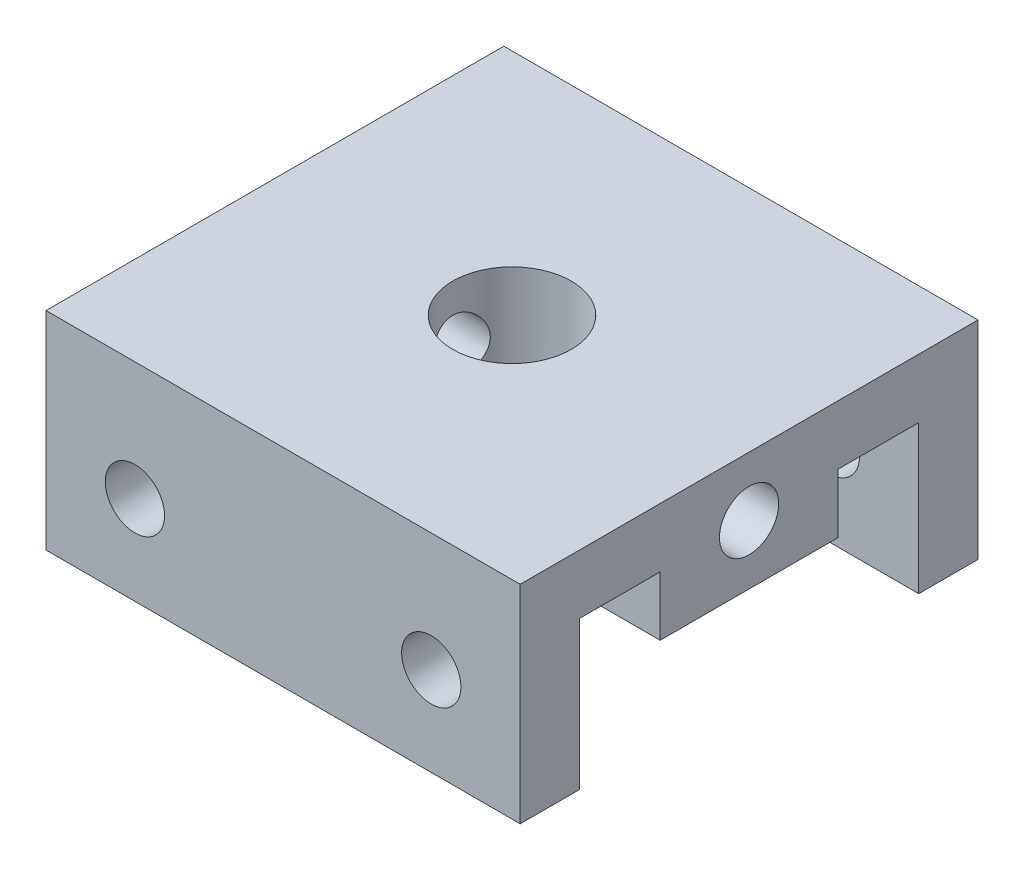
ISO-10303-21;
HEADER;
FILE_DESCRIPTION(('STEP AP214'),'2;1');
FILE_NAME('part.step','',(''),(''),'','','');
FILE_SCHEMA(('AUTOMOTIVE_DESIGN { 1 0 10303 214 1 1 1 1 }'));
ENDSEC;
DATA;
#1=APPLICATION_CONTEXT('core data for automotive mechanical design processes');
#2=APPLICATION_PROTOCOL_DEFINITION('international standard','automotive_design',2000,#1);
#3=PRODUCT_CONTEXT('',#1,'mechanical');
#4=PRODUCT('Part','Part','',(#3));
#5=PRODUCT_RELATED_PRODUCT_CATEGORY('part','',(#4));
#6=PRODUCT_DEFINITION_FORMATION('','',#4);
#7=PRODUCT_DEFINITION_CONTEXT('part definition',#1,'design');
#8=PRODUCT_DEFINITION('design','',#6,#7);
#9=PRODUCT_DEFINITION_SHAPE('','',#8);
#10=(LENGTH_UNIT() NAMED_UNIT(*) SI_UNIT(.MILLI.,.METRE.));
#11=(NAMED_UNIT(*) PLANE_ANGLE_UNIT() SI_UNIT($,.RADIAN.));
#12=(NAMED_UNIT(*) SI_UNIT($,.STERADIAN.) SOLID_ANGLE_UNIT());
#13=UNCERTAINTY_MEASURE_WITH_UNIT(LENGTH_MEASURE(1.E-05),#10,'distance_accuracy_value','');
#14=(GEOMETRIC_REPRESENTATION_CONTEXT(3) GLOBAL_UNCERTAINTY_ASSIGNED_CONTEXT((#13)) GLOBAL_UNIT_ASSIGNED_CONTEXT((#10,
#11,#12)) REPRESENTATION_CONTEXT('',''));
#15=CARTESIAN_POINT('',(0.,0.,0.));
#16=DIRECTION('',(0.,0.,1.));
#17=DIRECTION('',(1.,0.,0.));
#18=AXIS2_PLACEMENT_3D('',#15,#16,#17);
#19=CARTESIAN_POINT('',(-25.4,-6.35,18.17497));
#20=DIRECTION('',(0.,-1.,0.));
#21=DIRECTION('',(0.,0.,-1.));
#22=AXIS2_PLACEMENT_3D('',#19,#20,#21);
#23=PLANE('',#22);
#24=DIRECTION('',(0.,0.,-1.));
#25=VECTOR('',#24,1.);
#26=CARTESIAN_POINT('',(25.4,-6.35,18.17497));
#27=LINE('',#26,#25);
#28=CARTESIAN_POINT('',(25.4,-6.35,-9.525));
#29=VERTEX_POINT('',#28);
#30=CARTESIAN_POINT('',(25.4,-6.35,-18.17497));
#31=VERTEX_POINT('',#30);
#32=EDGE_CURVE('E190',#29,#31,#27,.T.);
#33=ORIENTED_EDGE('',*,*,#32,.F.);
#34=DIRECTION('',(1.,0.,0.));
#35=VECTOR('',#34,1.);
#36=CARTESIAN_POINT('',(25.4,-6.35,-9.525));
#37=LINE('',#36,#35);
#38=CARTESIAN_POINT('',(-25.4,-6.35,-9.525));
#39=VERTEX_POINT('',#38);
#40=EDGE_CURVE('E249',#39,#29,#37,.T.);
#41=ORIENTED_EDGE('',*,*,#40,.F.);
#42=DIRECTION('',(0.,0.,-1.));
#43=VECTOR('',#42,1.);
#44=CARTESIAN_POINT('',(-25.4,-6.35,18.17497));
#45=LINE('',#44,#43);
#46=CARTESIAN_POINT('',(-25.4,-6.35,-18.17497));
#47=VERTEX_POINT('',#46);
#48=EDGE_CURVE('E155',#39,#47,#45,.T.);
#49=ORIENTED_EDGE('',*,*,#48,.T.);
#50=DIRECTION('',(1.,0.,0.));
#51=VECTOR('',#50,1.);
#52=CARTESIAN_POINT('',(-25.4,-6.35,-18.17497));
#53=LINE('',#52,#51);
#54=EDGE_CURVE('E235',#47,#31,#53,.T.);
#55=ORIENTED_EDGE('',*,*,#54,.T.);
#56=EDGE_LOOP('',(#33,#41,#49,#55));
#57=FACE_BOUND('',#56,.T.);
#58=ADVANCED_FACE('F39',(#57),#23,.T.);
#59=CARTESIAN_POINT('',(-25.4,-6.35,18.17497));
#60=VERTEX_POINT('',#59);
#61=CARTESIAN_POINT('',(-25.4,-6.35,9.525));
#62=VERTEX_POINT('',#61);
#63=EDGE_CURVE('E214',#60,#62,#45,.T.);
#64=ORIENTED_EDGE('',*,*,#63,.T.);
#65=DIRECTION('',(-1.,0.,0.));
#66=VECTOR('',#65,1.);
#67=CARTESIAN_POINT('',(-25.4,-6.35,9.525));
#68=LINE('',#67,#66);
#69=CARTESIAN_POINT('',(25.4,-6.35,9.525));
#70=VERTEX_POINT('',#69);
#71=EDGE_CURVE('E150',#70,#62,#68,.T.);
#72=ORIENTED_EDGE('',*,*,#71,.F.);
#73=CARTESIAN_POINT('',(25.4,-6.35,18.17497));
#74=VERTEX_POINT('',#73);
#75=EDGE_CURVE('E191',#74,#70,#27,.T.);
#76=ORIENTED_EDGE('',*,*,#75,.F.);
#77=DIRECTION('',(1.,0.,0.));
#78=VECTOR('',#77,1.);
#79=CARTESIAN_POINT('',(-25.4,-6.35,18.17497));
#80=LINE('',#79,#78);
#81=EDGE_CURVE('E238',#60,#74,#80,.T.);
#82=ORIENTED_EDGE('',*,*,#81,.F.);
#83=EDGE_LOOP('',(#64,#72,#76,#82));
#84=FACE_BOUND('',#83,.T.);
#85=ADVANCED_FACE('F273',(#84),#23,.T.);
#86=CARTESIAN_POINT('',(-25.4,0.,24.52497));
#87=DIRECTION('',(0.,0.,1.));
#88=DIRECTION('',(0.,-1.,0.));
#89=AXIS2_PLACEMENT_3D('',#86,#87,#88);
#90=PLANE('',#89);
#91=CARTESIAN_POINT('',(15.875,-12.7,24.52497));
#92=DIRECTION('',(0.,0.,1.));
#93=DIRECTION('',(1.,0.,0.));
#94=AXIS2_PLACEMENT_3D('',#91,#92,#93);
#95=CIRCLE('',#94,3.175);
#96=CARTESIAN_POINT('',(19.05,-12.7,24.52497));
#97=VERTEX_POINT('',#96);
#98=EDGE_CURVE('E156',#97,#97,#95,.T.);
#99=ORIENTED_EDGE('',*,*,#98,.F.);
#100=EDGE_LOOP('',(#99));
#101=FACE_BOUND('',#100,.T.);
#102=CARTESIAN_POINT('',(-15.875,-12.7,24.52497));
#103=DIRECTION('',(0.,0.,1.));
#104=DIRECTION('',(1.,0.,0.));
#105=AXIS2_PLACEMENT_3D('',#102,#103,#104);
#106=CIRCLE('',#105,3.175);
#107=CARTESIAN_POINT('',(-12.7,-12.7,24.52497));
#108=VERTEX_POINT('',#107);
#109=EDGE_CURVE('E171',#108,#108,#106,.T.);
#110=ORIENTED_EDGE('',*,*,#109,.F.);
#111=EDGE_LOOP('',(#110));
#112=FACE_BOUND('',#111,.T.);
#113=DIRECTION('',(1.,0.,0.));
#114=VECTOR('',#113,1.);
#115=CARTESIAN_POINT('',(-25.4,-22.225,24.52497));
#116=LINE('',#115,#114);
#117=CARTESIAN_POINT('',(-25.4,-22.225,24.52497));
#118=VERTEX_POINT('',#117);
#119=CARTESIAN_POINT('',(25.4,-22.225,24.52497));
#120=VERTEX_POINT('',#119);
#121=EDGE_CURVE('E228',#118,#120,#116,.T.);
#122=ORIENTED_EDGE('',*,*,#121,.T.);
#123=DIRECTION('',(0.,-1.,0.));
#124=VECTOR('',#123,1.);
#125=CARTESIAN_POINT('',(25.4,0.,24.52497));
#126=LINE('',#125,#124);
#127=CARTESIAN_POINT('',(25.4,0.,24.52497));
#128=VERTEX_POINT('',#127);
#129=EDGE_CURVE('E181',#128,#120,#126,.T.);
#130=ORIENTED_EDGE('',*,*,#129,.F.);
#131=DIRECTION('',(1.,0.,0.));
#132=VECTOR('',#131,1.);
#133=CARTESIAN_POINT('',(-25.4,0.,24.52497));
#134=LINE('',#133,#132);
#135=CARTESIAN_POINT('',(-25.4,0.,24.52497));
#136=VERTEX_POINT('',#135);
#137=EDGE_CURVE('E11',#136,#128,#134,.T.);
#138=ORIENTED_EDGE('',*,*,#137,.F.);
#139=DIRECTION('',(0.,-1.,0.));
#140=VECTOR('',#139,1.);
#141=CARTESIAN_POINT('',(-25.4,0.,24.52497));
#142=LINE('',#141,#140);
#143=EDGE_CURVE('E206',#136,#118,#142,.T.);
#144=ORIENTED_EDGE('',*,*,#143,.T.);
#145=EDGE_LOOP('',(#122,#130,#138,#144));
#146=FACE_BOUND('',#145,.T.);
#147=ADVANCED_FACE('F41',(#101,#112,#146),#90,.T.);
#148=CARTESIAN_POINT('',(-25.4,0.,24.52497));
#149=DIRECTION('',(0.,1.,0.));
#150=DIRECTION('',(0.,0.,1.));
#151=AXIS2_PLACEMENT_3D('',#148,#149,#150);
#152=PLANE('',#151);
#153=CARTESIAN_POINT('',(0.,0.,0.));
#154=DIRECTION('',(0.,1.,0.));
#155=DIRECTION('',(0.,0.,1.));
#156=AXIS2_PLACEMENT_3D('',#153,#154,#155);
#157=CIRCLE('',#156,6.35);
#158=CARTESIAN_POINT('',(0.,0.,6.35));
#159=VERTEX_POINT('',#158);
#160=EDGE_CURVE('E250',#159,#159,#157,.T.);
#161=ORIENTED_EDGE('',*,*,#160,.F.);
#162=EDGE_LOOP('',(#161));
#163=FACE_BOUND('',#162,.T.);
#164=ORIENTED_EDGE('',*,*,#137,.T.);
#165=DIRECTION('',(0.,0.,1.));
#166=VECTOR('',#165,1.);
#167=CARTESIAN_POINT('',(25.4,0.,24.52497));
#168=LINE('',#167,#166);
#169=CARTESIAN_POINT('',(25.4,0.,-24.52497));
#170=VERTEX_POINT('',#169);
#171=EDGE_CURVE('E203',#170,#128,#168,.T.);
#172=ORIENTED_EDGE('',*,*,#171,.F.);
#173=DIRECTION('',(1.,0.,0.));
#174=VECTOR('',#173,1.);
#175=CARTESIAN_POINT('',(-25.4,0.,-24.52497));
#176=LINE('',#175,#174);
#177=CARTESIAN_POINT('',(-25.4,0.,-24.52497));
#178=VERTEX_POINT('',#177);
#179=EDGE_CURVE('E53',#178,#170,#176,.T.);
#180=ORIENTED_EDGE('',*,*,#179,.F.);
#181=DIRECTION('',(0.,0.,1.));
#182=VECTOR('',#181,1.);
#183=CARTESIAN_POINT('',(-25.4,0.,24.52497));
#184=LINE('',#183,#182);
#185=EDGE_CURVE('E226',#178,#136,#184,.T.);
#186=ORIENTED_EDGE('',*,*,#185,.T.);
#187=EDGE_LOOP('',(#164,#172,#180,#186));
#188=FACE_BOUND('',#187,.T.);
#189=ADVANCED_FACE('F335',(#163,#188),#152,.T.);
#190=CARTESIAN_POINT('',(-25.4,0.,-24.52497));
#191=DIRECTION('',(0.,0.,-1.));
#192=DIRECTION('',(0.,1.,0.));
#193=AXIS2_PLACEMENT_3D('',#190,#191,#192);
#194=PLANE('',#193);
#195=CARTESIAN_POINT('',(15.875,-12.7,-24.52497));
#196=DIRECTION('',(0.,0.,-1.));
#197=DIRECTION('',(0.,1.,0.));
#198=AXIS2_PLACEMENT_3D('',#195,#196,#197);
#199=CIRCLE('',#198,3.175);
#200=CARTESIAN_POINT('',(15.875,-9.525,-24.52497));
#201=VERTEX_POINT('',#200);
#202=EDGE_CURVE('E168',#201,#201,#199,.T.);
#203=ORIENTED_EDGE('',*,*,#202,.F.);
#204=EDGE_LOOP('',(#203));
#205=FACE_BOUND('',#204,.T.);
#206=CARTESIAN_POINT('',(-15.875,-12.7,-24.52497));
#207=DIRECTION('',(0.,0.,-1.));
#208=DIRECTION('',(0.,1.,0.));
#209=AXIS2_PLACEMENT_3D('',#206,#207,#208);
#210=CIRCLE('',#209,3.175);
#211=CARTESIAN_POINT('',(-15.875,-9.52499999999999,-24.52497));
#212=VERTEX_POINT('',#211);
#213=EDGE_CURVE('E178',#212,#212,#210,.T.);
#214=ORIENTED_EDGE('',*,*,#213,.F.);
#215=EDGE_LOOP('',(#214));
#216=FACE_BOUND('',#215,.T.);
#217=ORIENTED_EDGE('',*,*,#179,.T.);
#218=DIRECTION('',(0.,1.,0.));
#219=VECTOR('',#218,1.);
#220=CARTESIAN_POINT('',(25.4,0.,-24.52497));
#221=LINE('',#220,#219);
#222=CARTESIAN_POINT('',(25.4,-22.225,-24.52497));
#223=VERTEX_POINT('',#222);
#224=EDGE_CURVE('E200',#223,#170,#221,.T.);
#225=ORIENTED_EDGE('',*,*,#224,.F.);
#226=DIRECTION('',(1.,0.,0.));
#227=VECTOR('',#226,1.);
#228=CARTESIAN_POINT('',(-25.4,-22.225,-24.52497));
#229=LINE('',#228,#227);
#230=CARTESIAN_POINT('',(-25.4,-22.225,-24.52497));
#231=VERTEX_POINT('',#230);
#232=EDGE_CURVE('E231',#231,#223,#229,.T.);
#233=ORIENTED_EDGE('',*,*,#232,.F.);
#234=DIRECTION('',(0.,1.,0.));
#235=VECTOR('',#234,1.);
#236=CARTESIAN_POINT('',(-25.4,0.,-24.52497));
#237=LINE('',#236,#235);
#238=EDGE_CURVE('E223',#231,#178,#237,.T.);
#239=ORIENTED_EDGE('',*,*,#238,.T.);
#240=EDGE_LOOP('',(#217,#225,#233,#239));
#241=FACE_BOUND('',#240,.T.);
#242=ADVANCED_FACE('F338',(#205,#216,#241),#194,.T.);
#243=CARTESIAN_POINT('',(-25.4,-22.225,-18.17497));
#244=DIRECTION('',(0.,-1.,0.));
#245=DIRECTION('',(0.,0.,-1.));
#246=AXIS2_PLACEMENT_3D('',#243,#244,#245);
#247=PLANE('',#246);
#248=ORIENTED_EDGE('',*,*,#232,.T.);
#249=DIRECTION('',(0.,0.,-1.));
#250=VECTOR('',#249,1.);
#251=CARTESIAN_POINT('',(25.4,-22.225,-18.17497));
#252=LINE('',#251,#250);
#253=CARTESIAN_POINT('',(25.4,-22.225,-18.17497));
#254=VERTEX_POINT('',#253);
#255=EDGE_CURVE('E197',#254,#223,#252,.T.);
#256=ORIENTED_EDGE('',*,*,#255,.F.);
#257=DIRECTION('',(1.,0.,0.));
#258=VECTOR('',#257,1.);
#259=CARTESIAN_POINT('',(-25.4,-22.225,-18.17497));
#260=LINE('',#259,#258);
#261=CARTESIAN_POINT('',(-25.4,-22.225,-18.17497));
#262=VERTEX_POINT('',#261);
#263=EDGE_CURVE('E233',#262,#254,#260,.T.);
#264=ORIENTED_EDGE('',*,*,#263,.F.);
#265=DIRECTION('',(0.,0.,-1.));
#266=VECTOR('',#265,1.);
#267=CARTESIAN_POINT('',(-25.4,-22.225,-18.17497));
#268=LINE('',#267,#266);
#269=EDGE_CURVE('E220',#262,#231,#268,.T.);
#270=ORIENTED_EDGE('',*,*,#269,.T.);
#271=EDGE_LOOP('',(#248,#256,#264,#270));
#272=FACE_BOUND('',#271,.T.);
#273=ADVANCED_FACE('F341',(#272),#247,.T.);
#274=CARTESIAN_POINT('',(-25.4,-6.35,-18.17497));
#275=DIRECTION('',(0.,0.,1.));
#276=DIRECTION('',(1.,0.,0.));
#277=AXIS2_PLACEMENT_3D('',#274,#275,#276);
#278=PLANE('',#277);
#279=CARTESIAN_POINT('',(15.875,-12.7,-18.17497));
#280=DIRECTION('',(0.,0.,1.));
#281=DIRECTION('',(1.,0.,0.));
#282=AXIS2_PLACEMENT_3D('',#279,#280,#281);
#283=CIRCLE('',#282,3.175);
#284=CARTESIAN_POINT('',(19.05,-12.7,-18.17497));
#285=VERTEX_POINT('',#284);
#286=EDGE_CURVE('E165',#285,#285,#283,.T.);
#287=ORIENTED_EDGE('',*,*,#286,.F.);
#288=EDGE_LOOP('',(#287));
#289=FACE_BOUND('',#288,.T.);
#290=CARTESIAN_POINT('',(-15.875,-12.7,-18.17497));
#291=DIRECTION('',(0.,0.,1.));
#292=DIRECTION('',(1.,0.,0.));
#293=AXIS2_PLACEMENT_3D('',#290,#291,#292);
#294=CIRCLE('',#293,3.175);
#295=CARTESIAN_POINT('',(-12.7,-12.7,-18.17497));
#296=VERTEX_POINT('',#295);
#297=EDGE_CURVE('E175',#296,#296,#294,.T.);
#298=ORIENTED_EDGE('',*,*,#297,.F.);
#299=EDGE_LOOP('',(#298));
#300=FACE_BOUND('',#299,.T.);
#301=ORIENTED_EDGE('',*,*,#263,.T.);
#302=DIRECTION('',(0.,-1.,0.));
#303=VECTOR('',#302,1.);
#304=CARTESIAN_POINT('',(25.4,-6.35,-18.17497));
#305=LINE('',#304,#303);
#306=EDGE_CURVE('E194',#31,#254,#305,.T.);
#307=ORIENTED_EDGE('',*,*,#306,.F.);
#308=ORIENTED_EDGE('',*,*,#54,.F.);
#309=DIRECTION('',(0.,-1.,0.));
#310=VECTOR('',#309,1.);
#311=CARTESIAN_POINT('',(-25.4,-6.35,-18.17497));
#312=LINE('',#311,#310);
#313=EDGE_CURVE('E217',#47,#262,#312,.T.);
#314=ORIENTED_EDGE('',*,*,#313,.T.);
#315=EDGE_LOOP('',(#301,#307,#308,#314));
#316=FACE_BOUND('',#315,.T.);
#317=ADVANCED_FACE('F284',(#289,#300,#316),#278,.T.);
#318=CARTESIAN_POINT('',(-25.4,-6.35,18.17497));
#319=DIRECTION('',(0.,0.,-1.));
#320=DIRECTION('',(0.,1.,0.));
#321=AXIS2_PLACEMENT_3D('',#318,#319,#320);
#322=PLANE('',#321);
#323=CARTESIAN_POINT('',(15.875,-12.7,18.17497));
#324=DIRECTION('',(0.,0.,-1.));
#325=DIRECTION('',(0.,1.,0.));
#326=AXIS2_PLACEMENT_3D('',#323,#324,#325);
#327=CIRCLE('',#326,3.175);
#328=CARTESIAN_POINT('',(15.875,-9.525,18.17497));
#329=VERTEX_POINT('',#328);
#330=EDGE_CURVE('E159',#329,#329,#327,.T.);
#331=ORIENTED_EDGE('',*,*,#330,.F.);
#332=EDGE_LOOP('',(#331));
#333=FACE_BOUND('',#332,.T.);
#334=CARTESIAN_POINT('',(-15.875,-12.7,18.17497));
#335=DIRECTION('',(0.,0.,-1.));
#336=DIRECTION('',(0.,1.,0.));
#337=AXIS2_PLACEMENT_3D('',#334,#335,#336);
#338=CIRCLE('',#337,3.175);
#339=CARTESIAN_POINT('',(-15.875,-9.52499999999999,18.17497));
#340=VERTEX_POINT('',#339);
#341=EDGE_CURVE('E174',#340,#340,#338,.T.);
#342=ORIENTED_EDGE('',*,*,#341,.F.);
#343=EDGE_LOOP('',(#342));
#344=FACE_BOUND('',#343,.T.);
#345=ORIENTED_EDGE('',*,*,#81,.T.);
#346=DIRECTION('',(0.,1.,0.));
#347=VECTOR('',#346,1.);
#348=CARTESIAN_POINT('',(25.4,-6.35,18.17497));
#349=LINE('',#348,#347);
#350=CARTESIAN_POINT('',(25.4,-22.225,18.17497));
#351=VERTEX_POINT('',#350);
#352=EDGE_CURVE('E187',#351,#74,#349,.T.);
#353=ORIENTED_EDGE('',*,*,#352,.F.);
#354=DIRECTION('',(1.,0.,0.));
#355=VECTOR('',#354,1.);
#356=CARTESIAN_POINT('',(-25.4,-22.225,18.17497));
#357=LINE('',#356,#355);
#358=CARTESIAN_POINT('',(-25.4,-22.225,18.17497));
#359=VERTEX_POINT('',#358);
#360=EDGE_CURVE('E240',#359,#351,#357,.T.);
#361=ORIENTED_EDGE('',*,*,#360,.F.);
#362=DIRECTION('',(0.,1.,0.));
#363=VECTOR('',#362,1.);
#364=CARTESIAN_POINT('',(-25.4,-6.35,18.17497));
#365=LINE('',#364,#363);
#366=EDGE_CURVE('E211',#359,#60,#365,.T.);
#367=ORIENTED_EDGE('',*,*,#366,.T.);
#368=EDGE_LOOP('',(#345,#353,#361,#367));
#369=FACE_BOUND('',#368,.T.);
#370=ADVANCED_FACE('F286',(#333,#344,#369),#322,.T.);
#371=CARTESIAN_POINT('',(-25.4,-22.225,24.52497));
#372=DIRECTION('',(0.,-1.,0.));
#373=DIRECTION('',(0.,0.,-1.));
#374=AXIS2_PLACEMENT_3D('',#371,#372,#373);
#375=PLANE('',#374);
#376=ORIENTED_EDGE('',*,*,#360,.T.);
#377=DIRECTION('',(0.,0.,-1.));
#378=VECTOR('',#377,1.);
#379=CARTESIAN_POINT('',(25.4,-22.225,24.52497));
#380=LINE('',#379,#378);
#381=EDGE_CURVE('E184',#120,#351,#380,.T.);
#382=ORIENTED_EDGE('',*,*,#381,.F.);
#383=ORIENTED_EDGE('',*,*,#121,.F.);
#384=DIRECTION('',(0.,0.,-1.));
#385=VECTOR('',#384,1.);
#386=CARTESIAN_POINT('',(-25.4,-22.225,24.52497));
#387=LINE('',#386,#385);
#388=EDGE_CURVE('E208',#118,#359,#387,.T.);
#389=ORIENTED_EDGE('',*,*,#388,.T.);
#390=EDGE_LOOP('',(#376,#382,#383,#389));
#391=FACE_BOUND('',#390,.T.);
#392=ADVANCED_FACE('F288',(#391),#375,.T.);
#393=CARTESIAN_POINT('',(-25.4,0.,0.));
#394=DIRECTION('',(1.,0.,0.));
#395=DIRECTION('',(0.,0.,-1.));
#396=AXIS2_PLACEMENT_3D('',#393,#394,#395);
#397=PLANE('',#396);
#398=CARTESIAN_POINT('',(-25.4,-6.35,0.));
#399=DIRECTION('',(-1.,0.,0.));
#400=DIRECTION('',(0.,0.,1.));
#401=AXIS2_PLACEMENT_3D('',#398,#399,#400);
#402=CIRCLE('',#401,3.175);
#403=CARTESIAN_POINT('',(-25.4,-6.35,3.175));
#404=VERTEX_POINT('',#403);
#405=EDGE_CURVE('E318',#404,#404,#402,.T.);
#406=ORIENTED_EDGE('',*,*,#405,.F.);
#407=EDGE_LOOP('',(#406));
#408=FACE_BOUND('',#407,.T.);
#409=ORIENTED_EDGE('',*,*,#143,.F.);
#410=ORIENTED_EDGE('',*,*,#185,.F.);
#411=ORIENTED_EDGE('',*,*,#238,.F.);
#412=ORIENTED_EDGE('',*,*,#269,.F.);
#413=ORIENTED_EDGE('',*,*,#313,.F.);
#414=ORIENTED_EDGE('',*,*,#48,.F.);
#415=DIRECTION('',(0.,1.,0.));
#416=VECTOR('',#415,1.);
#417=CARTESIAN_POINT('',(-25.4,-12.7,-9.525));
#418=LINE('',#417,#416);
#419=CARTESIAN_POINT('',(-25.4,-12.7,-9.525));
#420=VERTEX_POINT('',#419);
#421=EDGE_CURVE('E137',#420,#39,#418,.T.);
#422=ORIENTED_EDGE('',*,*,#421,.F.);
#423=DIRECTION('',(0.,0.,-1.));
#424=VECTOR('',#423,1.);
#425=CARTESIAN_POINT('',(-25.4,-12.7,9.525));
#426=LINE('',#425,#424);
#427=CARTESIAN_POINT('',(-25.4,-12.7,9.525));
#428=VERTEX_POINT('',#427);
#429=EDGE_CURVE('E141',#428,#420,#426,.T.);
#430=ORIENTED_EDGE('',*,*,#429,.F.);
#431=DIRECTION('',(0.,1.,0.));
#432=VECTOR('',#431,1.);
#433=CARTESIAN_POINT('',(-25.4,-12.7,9.525));
#434=LINE('',#433,#432);
#435=EDGE_CURVE('E308',#428,#62,#434,.T.);
#436=ORIENTED_EDGE('',*,*,#435,.T.);
#437=ORIENTED_EDGE('',*,*,#63,.F.);
#438=ORIENTED_EDGE('',*,*,#366,.F.);
#439=ORIENTED_EDGE('',*,*,#388,.F.);
#440=EDGE_LOOP('',(#409,#410,#411,#412,#413,#414,#422,#430,#436,#437,#438,#439));
#441=FACE_BOUND('',#440,.T.);
#442=ADVANCED_FACE('F153',(#408,#441),#397,.F.);
#443=CARTESIAN_POINT('',(25.4,0.,0.));
#444=DIRECTION('',(1.,0.,0.));
#445=DIRECTION('',(0.,0.,-1.));
#446=AXIS2_PLACEMENT_3D('',#443,#444,#445);
#447=PLANE('',#446);
#448=CARTESIAN_POINT('',(25.4,-6.35,0.));
#449=DIRECTION('',(-1.,0.,0.));
#450=DIRECTION('',(0.,0.,1.));
#451=AXIS2_PLACEMENT_3D('',#448,#449,#450);
#452=CIRCLE('',#451,3.175);
#453=CARTESIAN_POINT('',(25.4,-6.35,3.175));
#454=VERTEX_POINT('',#453);
#455=EDGE_CURVE('E256',#454,#454,#452,.T.);
#456=ORIENTED_EDGE('',*,*,#455,.T.);
#457=EDGE_LOOP('',(#456));
#458=FACE_BOUND('',#457,.T.);
#459=ORIENTED_EDGE('',*,*,#129,.T.);
#460=ORIENTED_EDGE('',*,*,#381,.T.);
#461=ORIENTED_EDGE('',*,*,#352,.T.);
#462=ORIENTED_EDGE('',*,*,#75,.T.);
#463=DIRECTION('',(0.,1.,0.));
#464=VECTOR('',#463,1.);
#465=CARTESIAN_POINT('',(25.4,-12.7,9.525));
#466=LINE('',#465,#464);
#467=CARTESIAN_POINT('',(25.4,-12.7,9.525));
#468=VERTEX_POINT('',#467);
#469=EDGE_CURVE('E161',#468,#70,#466,.T.);
#470=ORIENTED_EDGE('',*,*,#469,.F.);
#471=DIRECTION('',(0.,0.,1.));
#472=VECTOR('',#471,1.);
#473=CARTESIAN_POINT('',(25.4,-12.7,9.525));
#474=LINE('',#473,#472);
#475=CARTESIAN_POINT('',(25.4,-12.7,-9.525));
#476=VERTEX_POINT('',#475);
#477=EDGE_CURVE('E140',#476,#468,#474,.T.);
#478=ORIENTED_EDGE('',*,*,#477,.F.);
#479=DIRECTION('',(0.,1.,0.));
#480=VECTOR('',#479,1.);
#481=CARTESIAN_POINT('',(25.4,-12.7,-9.525));
#482=LINE('',#481,#480);
#483=EDGE_CURVE('E61',#476,#29,#482,.T.);
#484=ORIENTED_EDGE('',*,*,#483,.T.);
#485=ORIENTED_EDGE('',*,*,#32,.T.);
#486=ORIENTED_EDGE('',*,*,#306,.T.);
#487=ORIENTED_EDGE('',*,*,#255,.T.);
#488=ORIENTED_EDGE('',*,*,#224,.T.);
#489=ORIENTED_EDGE('',*,*,#171,.T.);
#490=EDGE_LOOP('',(#459,#460,#461,#462,#470,#478,#484,#485,#486,#487,#488,#489));
#491=FACE_BOUND('',#490,.T.);
#492=ADVANCED_FACE('F297',(#458,#491),#447,.T.);
#493=CARTESIAN_POINT('',(-15.875,-12.7,-26.27503));
#494=DIRECTION('',(0.,0.,1.));
#495=DIRECTION('',(1.,0.,0.));
#496=AXIS2_PLACEMENT_3D('',#493,#494,#495);
#497=CYLINDRICAL_SURFACE('',#496,3.175);
#498=ORIENTED_EDGE('',*,*,#341,.T.);
#499=EDGE_LOOP('',(#498));
#500=FACE_BOUND('',#499,.T.);
#501=ORIENTED_EDGE('',*,*,#109,.T.);
#502=EDGE_LOOP('',(#501));
#503=FACE_BOUND('',#502,.T.);
#504=ADVANCED_FACE('F324',(#500,#503),#497,.F.);
#505=ORIENTED_EDGE('',*,*,#213,.T.);
#506=EDGE_LOOP('',(#505));
#507=FACE_BOUND('',#506,.T.);
#508=ORIENTED_EDGE('',*,*,#297,.T.);
#509=EDGE_LOOP('',(#508));
#510=FACE_BOUND('',#509,.T.);
#511=ADVANCED_FACE('F330',(#507,#510),#497,.F.);
#512=CARTESIAN_POINT('',(15.875,-12.7,-26.27503));
#513=DIRECTION('',(0.,0.,1.));
#514=DIRECTION('',(1.,0.,0.));
#515=AXIS2_PLACEMENT_3D('',#512,#513,#514);
#516=CYLINDRICAL_SURFACE('',#515,3.175);
#517=ORIENTED_EDGE('',*,*,#330,.T.);
#518=EDGE_LOOP('',(#517));
#519=FACE_BOUND('',#518,.T.);
#520=ORIENTED_EDGE('',*,*,#98,.T.);
#521=EDGE_LOOP('',(#520));
#522=FACE_BOUND('',#521,.T.);
#523=ADVANCED_FACE('F367',(#519,#522),#516,.F.);
#524=ORIENTED_EDGE('',*,*,#202,.T.);
#525=EDGE_LOOP('',(#524));
#526=FACE_BOUND('',#525,.T.);
#527=ORIENTED_EDGE('',*,*,#286,.T.);
#528=EDGE_LOOP('',(#527));
#529=FACE_BOUND('',#528,.T.);
#530=ADVANCED_FACE('F369',(#526,#529),#516,.F.);
#531=CARTESIAN_POINT('',(25.4,-12.7,-9.525));
#532=DIRECTION('',(0.,0.,1.));
#533=DIRECTION('',(1.,0.,0.));
#534=AXIS2_PLACEMENT_3D('',#531,#532,#533);
#535=PLANE('',#534);
#536=ORIENTED_EDGE('',*,*,#40,.T.);
#537=ORIENTED_EDGE('',*,*,#483,.F.);
#538=DIRECTION('',(1.,0.,0.));
#539=VECTOR('',#538,1.);
#540=CARTESIAN_POINT('',(-25.4,-12.7,-9.525));
#541=LINE('',#540,#539);
#542=EDGE_CURVE('E133',#420,#476,#541,.T.);
#543=ORIENTED_EDGE('',*,*,#542,.F.);
#544=ORIENTED_EDGE('',*,*,#421,.T.);
#545=EDGE_LOOP('',(#536,#537,#543,#544));
#546=FACE_BOUND('',#545,.T.);
#547=ADVANCED_FACE('F135',(#546),#535,.F.);
#548=CARTESIAN_POINT('',(-25.4,-12.7,9.525));
#549=DIRECTION('',(0.,0.,-1.));
#550=DIRECTION('',(-1.,0.,0.));
#551=AXIS2_PLACEMENT_3D('',#548,#549,#550);
#552=PLANE('',#551);
#553=ORIENTED_EDGE('',*,*,#71,.T.);
#554=ORIENTED_EDGE('',*,*,#435,.F.);
#555=DIRECTION('',(-1.,0.,0.));
#556=VECTOR('',#555,1.);
#557=CARTESIAN_POINT('',(25.4,-12.7,9.525));
#558=LINE('',#557,#556);
#559=EDGE_CURVE('E146',#468,#428,#558,.T.);
#560=ORIENTED_EDGE('',*,*,#559,.F.);
#561=ORIENTED_EDGE('',*,*,#469,.T.);
#562=EDGE_LOOP('',(#553,#554,#560,#561));
#563=FACE_BOUND('',#562,.T.);
#564=ADVANCED_FACE('F379',(#563),#552,.F.);
#565=CARTESIAN_POINT('',(0.,-12.7,0.));
#566=DIRECTION('',(0.,-1.,0.));
#567=DIRECTION('',(0.,0.,-1.));
#568=AXIS2_PLACEMENT_3D('',#565,#566,#567);
#569=PLANE('',#568);
#570=CARTESIAN_POINT('',(0.,-12.7,0.));
#571=DIRECTION('',(0.,-1.,0.));
#572=DIRECTION('',(0.,0.,-1.));
#573=AXIS2_PLACEMENT_3D('',#570,#571,#572);
#574=CIRCLE('',#573,6.35);
#575=CARTESIAN_POINT('',(0.,-12.7,-6.35));
#576=VERTEX_POINT('',#575);
#577=EDGE_CURVE('E247',#576,#576,#574,.T.);
#578=ORIENTED_EDGE('',*,*,#577,.F.);
#579=EDGE_LOOP('',(#578));
#580=FACE_BOUND('',#579,.T.);
#581=ORIENTED_EDGE('',*,*,#429,.T.);
#582=ORIENTED_EDGE('',*,*,#542,.T.);
#583=ORIENTED_EDGE('',*,*,#477,.T.);
#584=ORIENTED_EDGE('',*,*,#559,.T.);
#585=EDGE_LOOP('',(#581,#582,#583,#584));
#586=FACE_BOUND('',#585,.T.);
#587=ADVANCED_FACE('F144',(#580,#586),#569,.T.);
#588=CARTESIAN_POINT('',(0.,-50.8,0.));
#589=DIRECTION('',(0.,1.,0.));
#590=DIRECTION('',(0.,0.,1.));
#591=AXIS2_PLACEMENT_3D('',#588,#589,#590);
#592=CYLINDRICAL_SURFACE('',#591,6.35);
#593=CARTESIAN_POINT('',(5.49926131403118,-6.35,3.175));
#594=CARTESIAN_POINT('',(5.49926232876913,-6.43276191353255,3.17499905676822));
#595=CARTESIAN_POINT('',(5.50113815093942,-6.51553391504167,3.1717573852825));
#596=CARTESIAN_POINT('',(5.50856077670455,-6.68042021285867,3.15884523354688));
#597=CARTESIAN_POINT('',(5.51410928932437,-6.76253418495082,3.1491717603564));
#598=CARTESIAN_POINT('',(5.53601678924102,-7.0071657484108,3.11062065473092));
#599=CARTESIAN_POINT('',(5.55763722742636,-7.16782804698103,3.07221261154103));
#600=CARTESIAN_POINT('',(5.61178865498313,-7.47859781214575,2.97211747978078));
#601=CARTESIAN_POINT('',(5.6442615458663,-7.62875644018636,2.9105541372517));
#602=CARTESIAN_POINT('',(5.71635543890045,-7.91661142280003,2.76627435445934));
#603=CARTESIAN_POINT('',(5.75597682772092,-8.05430710263429,2.68355676984061));
#604=CARTESIAN_POINT('',(5.84190034267495,-8.32582382133968,2.49131627779835));
#605=CARTESIAN_POINT('',(5.88848395338309,-8.45838859728169,2.38014521787043));
#606=CARTESIAN_POINT('',(5.98081052060146,-8.70397079125477,2.13758083606043));
#607=CARTESIAN_POINT('',(6.02655304768282,-8.816978458905,2.00617748851801));
#608=CARTESIAN_POINT('',(6.11573187346572,-9.02769095285005,1.71605436473863));
#609=CARTESIAN_POINT('',(6.15880487346127,-9.12385077893965,1.55609032527602));
#610=CARTESIAN_POINT('',(6.23413651147239,-9.28732214311138,1.21969855929243));
#611=CARTESIAN_POINT('',(6.26640197156108,-9.35465188718596,1.04328130884119));
#612=CARTESIAN_POINT('',(6.31445464313237,-9.45357731453854,0.692292696730404));
#613=CARTESIAN_POINT('',(6.33125099630315,-9.48737474679419,0.51848318375818));
#614=CARTESIAN_POINT('',(6.35024078782237,-9.52552742617825,0.166911747158856));
#615=CARTESIAN_POINT('',(6.35244306187831,-9.52990048775664,-0.010847719616678));
#616=CARTESIAN_POINT('',(6.34247467450733,-9.50992929879483,-0.348718268640212));
#617=CARTESIAN_POINT('',(6.33153724004097,-9.48804925678407,-0.509019820270688));
#618=CARTESIAN_POINT('',(6.29838229153245,-9.42060336454205,-0.823321212955329));
#619=CARTESIAN_POINT('',(6.27616393341038,-9.37503574191341,-0.977320581525263));
#620=CARTESIAN_POINT('',(6.22209775234818,-9.2612126859772,-1.27733236684466));
#621=CARTESIAN_POINT('',(6.19012095460315,-9.19265207947932,-1.42320480220676));
#622=CARTESIAN_POINT('',(6.11942032404916,-9.03521427998409,-1.70172616219331));
#623=CARTESIAN_POINT('',(6.08069407688628,-8.94632981335227,-1.83437032813194));
#624=CARTESIAN_POINT('',(5.99580926070808,-8.74110469841399,-2.09605211974366));
#625=CARTESIAN_POINT('',(5.94929416927823,-8.62296290957092,-2.22356359612797));
#626=CARTESIAN_POINT('',(5.85642633307518,-8.36743760647979,-2.45777846555886));
#627=CARTESIAN_POINT('',(5.81007373990265,-8.23003942646041,-2.56446584928023));
#628=CARTESIAN_POINT('',(5.71957289604347,-7.92905223163107,-2.76069102698818));
#629=CARTESIAN_POINT('',(5.67575155752789,-7.76435408894133,-2.84870951352547));
#630=CARTESIAN_POINT('',(5.61885247415839,-7.50616243386923,-2.95849503046443));
#631=CARTESIAN_POINT('',(5.60135560040996,-7.41822207148829,-2.99138760520285));
#632=CARTESIAN_POINT('',(5.56999217748627,-7.23920256178856,-3.04938956554735));
#633=CARTESIAN_POINT('',(5.55612339050229,-7.14812538868085,-3.07450375064138));
#634=CARTESIAN_POINT('',(5.53355357587716,-6.97084836859624,-3.11492823782859));
#635=CARTESIAN_POINT('',(5.52453156228568,-6.88482935786662,-3.13085491331031));
#636=CARTESIAN_POINT('',(5.51045313491466,-6.71148937241193,-3.15556797554225));
#637=CARTESIAN_POINT('',(5.50539465890766,-6.62416909886637,-3.16435807553686));
#638=CARTESIAN_POINT('',(5.49945626530651,-6.4489848511338,-3.17466835867007));
#639=CARTESIAN_POINT('',(5.49857479177741,-6.36112109160959,-3.17619124884848));
#640=CARTESIAN_POINT('',(5.50101508803298,-6.18565516235741,-3.17195985852084));
#641=CARTESIAN_POINT('',(5.50433657410105,-6.09805297537237,-3.16620606921981));
#642=CARTESIAN_POINT('',(5.51925588435845,-5.85590741435482,-3.14018226453034));
#643=CARTESIAN_POINT('',(5.53528611699027,-5.70239439247137,-3.11209439281024));
#644=CARTESIAN_POINT('',(5.57828096923593,-5.40265311940665,-3.0343376295836));
#645=CARTESIAN_POINT('',(5.60524912972109,-5.25642724447968,-2.98466174914483));
#646=CARTESIAN_POINT('',(5.66852625788959,-4.96757737335141,-2.86273054239685));
#647=CARTESIAN_POINT('',(5.70520999770139,-4.82543386796816,-2.78953600385261));
#648=CARTESIAN_POINT('',(5.7834564691364,-4.55463281522928,-2.62346157669833));
#649=CARTESIAN_POINT('',(5.82502170218951,-4.42598224655787,-2.53057157570877));
#650=CARTESIAN_POINT('',(5.91464405440152,-4.16884312848128,-2.31405795861388));
#651=CARTESIAN_POINT('',(5.96285904289681,-4.04241923829748,-2.18803622695198));
#652=CARTESIAN_POINT('',(6.0558119327906,-3.81186595247963,-1.91580928554187));
#653=CARTESIAN_POINT('',(6.10054865642871,-3.70774408767676,-1.76959728537411));
#654=CARTESIAN_POINT('',(6.18303824145362,-3.52242847331789,-1.45584977269243));
#655=CARTESIAN_POINT('',(6.22057562531784,-3.44191236317373,-1.28785333421913));
#656=CARTESIAN_POINT('',(6.28279651772886,-3.31108714177129,-0.93828350831361));
#657=CARTESIAN_POINT('',(6.30749131056505,-3.26075150612559,-0.756722200806245));
#658=CARTESIAN_POINT('',(6.33944338582815,-3.19605480945969,-0.403160492410787));
#659=CARTESIAN_POINT('',(6.34809271326659,-3.17881673569817,-0.231811338563334));
#660=CARTESIAN_POINT('',(6.35133763722966,-3.17232264057451,0.111525009731682));
#661=CARTESIAN_POINT('',(6.3459381534549,-3.18305682371448,0.283511959769309));
#662=CARTESIAN_POINT('',(6.32250351776756,-3.23029705955796,0.611308110350746));
#663=CARTESIAN_POINT('',(6.30532443151586,-3.26505827986283,0.767436553820506));
#664=CARTESIAN_POINT('',(6.26084894800281,-3.35701333933392,1.07139095342116));
#665=CARTESIAN_POINT('',(6.23355109988091,-3.41421039549079,1.21921571544173));
#666=CARTESIAN_POINT('',(6.16984840144776,-3.55195793786225,1.50946910032131));
#667=CARTESIAN_POINT('',(6.13310397734646,-3.6334026281259,1.65139651176319));
#668=CARTESIAN_POINT('',(6.05434784579293,-3.81621815432935,1.92016030444462));
#669=CARTESIAN_POINT('',(6.0123337223239,-3.91759814225474,2.04698971133066));
#670=CARTESIAN_POINT('',(5.92228494250573,-4.14907383129508,2.29524860659569));
#671=CARTESIAN_POINT('',(5.87406724075615,-4.28102323115206,2.41488454123001));
#672=CARTESIAN_POINT('',(5.78049654064408,-4.5639337305409,2.63101905620371));
#673=CARTESIAN_POINT('',(5.73514610261339,-4.71491147125789,2.7274971667743));
#674=CARTESIAN_POINT('',(5.67271720109896,-4.95567948124437,2.85396050304135));
#675=CARTESIAN_POINT('',(5.65257123598791,-5.03975772270639,2.89354057606825));
#676=CARTESIAN_POINT('',(5.61522862075768,-5.21160722451755,2.96535747654718));
#677=CARTESIAN_POINT('',(5.59803045260694,-5.2993765548833,2.99759808643801));
#678=CARTESIAN_POINT('',(5.5673118679383,-5.47776900842465,3.0542719435453));
#679=CARTESIAN_POINT('',(5.55378200380455,-5.56838411683044,3.07872527562275));
#680=CARTESIAN_POINT('',(5.53094387019911,-5.75188847854092,3.11956903021308));
#681=CARTESIAN_POINT('',(5.52163264949546,-5.84477609397432,3.13596509002515));
#682=CARTESIAN_POINT('',(5.50956192150408,-6.00646374879594,3.15710761797221));
#683=CARTESIAN_POINT('',(5.5057086840578,-6.07493367275989,3.16381073091702));
#684=CARTESIAN_POINT('',(5.50055787263126,-6.212266718613,3.17275746355016));
#685=CARTESIAN_POINT('',(5.49926046961937,-6.28112986649722,3.17500078490813));
#686=CARTESIAN_POINT('',(5.49926131403118,-6.35,3.175));
#687=B_SPLINE_CURVE_WITH_KNOTS('',3,(#593,#594,#595,#596,#597,#598,#599,#600,#601,#602,#603,
#604,#605,#606,#607,#608,#609,#610,#611,#612,#613,#614,#615,#616,#617,#618,#619,#620,#621,#622,
#623,#624,#625,#626,#627,#628,#629,#630,#631,#632,#633,#634,#635,#636,#637,#638,#639,#640,#641,
#642,#643,#644,#645,#646,#647,#648,#649,#650,#651,#652,#653,#654,#655,#656,#657,#658,#659,#660,
#661,#662,#663,#664,#665,#666,#667,#668,#669,#670,#671,#672,#673,#674,#675,#676,#677,#678,#679,
#680,#681,#682,#683,#684,#685,#686),.UNSPECIFIED.,.T.,.F.,(4,2,2,2,2,2,2,2,2,2,2,2,2,2,2,2,2,2,
2,2,2,2,2,2,2,2,2,2,2,2,2,2,2,2,2,2,2,2,2,2,2,2,2,2,2,2,4),(0.,0.248210314193368,
0.496536210172845,0.993616655653378,1.48807751301481,1.98256512428753,2.51783706318107,
3.05337510292796,3.62501229957992,4.19628797710272,4.72691486873112,5.25722047303095,
5.74141031613327,6.22563639342838,6.71656194871309,7.20766347537031,7.74518754975546,
8.28312325280709,8.85521994590916,9.14138502893469,9.42737318655796,9.69083660833535,
9.95416285897606,10.2173910127766,10.4806013985705,10.9489167635524,11.4173838546846,
11.9075481007329,12.3979646273261,12.9502005485241,13.5026226528975,14.0696241997013,
14.6361266987681,15.1506510247058,15.6649951955482,16.1454469295095,16.625967578846,
17.1270402751829,17.6283435455375,18.1795366185793,18.7312151251733,19.0161455987001,
19.3009288973909,19.5849716229022,19.8688153329579,20.075349152287,20.2818967868888),.UNSPECIFIED.);
#688=CARTESIAN_POINT('',(5.49926131403118,-6.35,3.175));
#689=VERTEX_POINT('',#688);
#690=EDGE_CURVE('E43',#689,#689,#687,.T.);
#691=ORIENTED_EDGE('',*,*,#690,.T.);
#692=EDGE_LOOP('',(#691));
#693=FACE_BOUND('',#692,.T.);
#694=CARTESIAN_POINT('',(-5.49926131403118,-6.35,3.175));
#695=CARTESIAN_POINT('',(-5.49926232876913,-6.26723808646745,3.17499905676822));
#696=CARTESIAN_POINT('',(-5.50113815093942,-6.18446608495833,3.1717573852825));
#697=CARTESIAN_POINT('',(-5.50856077670455,-6.01957978714132,3.15884523354688));
#698=CARTESIAN_POINT('',(-5.51410928932437,-5.93746581504917,3.1491717603564));
#699=CARTESIAN_POINT('',(-5.53601678924102,-5.6928342515892,3.11062065473092));
#700=CARTESIAN_POINT('',(-5.55763722742636,-5.53217195301897,3.07221261154103));
#701=CARTESIAN_POINT('',(-5.61178865498313,-5.22140218785425,2.97211747978078));
#702=CARTESIAN_POINT('',(-5.6442615458663,-5.07124355981364,2.9105541372517));
#703=CARTESIAN_POINT('',(-5.71635543890045,-4.78338857719997,2.76627435445934));
#704=CARTESIAN_POINT('',(-5.75597682772092,-4.64569289736571,2.68355676984061));
#705=CARTESIAN_POINT('',(-5.84190034267495,-4.37417617866033,2.49131627779835));
#706=CARTESIAN_POINT('',(-5.88848395338309,-4.24161140271831,2.38014521787043));
#707=CARTESIAN_POINT('',(-5.98081052060146,-3.99602920874523,2.13758083606043));
#708=CARTESIAN_POINT('',(-6.02655304768282,-3.883021541095,2.00617748851801));
#709=CARTESIAN_POINT('',(-6.11573187346572,-3.67230904714995,1.71605436473863));
#710=CARTESIAN_POINT('',(-6.15880487346127,-3.57614922106035,1.55609032527602));
#711=CARTESIAN_POINT('',(-6.23413651147239,-3.41267785688862,1.21969855929243));
#712=CARTESIAN_POINT('',(-6.26640197156108,-3.34534811281404,1.04328130884119));
#713=CARTESIAN_POINT('',(-6.31445464313237,-3.24642268546146,0.692292696730402));
#714=CARTESIAN_POINT('',(-6.33125099630315,-3.21262525320581,0.518483183758178));
#715=CARTESIAN_POINT('',(-6.35024078782237,-3.17447257382175,0.166911747158855));
#716=CARTESIAN_POINT('',(-6.35244306187831,-3.17009951224336,-0.0108477196166796));
#717=CARTESIAN_POINT('',(-6.34247467450733,-3.19007070120517,-0.348718268640214));
#718=CARTESIAN_POINT('',(-6.33153724004097,-3.21195074321593,-0.509019820270689));
#719=CARTESIAN_POINT('',(-6.29838229153245,-3.27939663545795,-0.82332121295533));
#720=CARTESIAN_POINT('',(-6.27616393341038,-3.32496425808659,-0.977320581525265));
#721=CARTESIAN_POINT('',(-6.22209775234818,-3.4387873140228,-1.27733236684466));
#722=CARTESIAN_POINT('',(-6.19012095460315,-3.50734792052068,-1.42320480220676));
#723=CARTESIAN_POINT('',(-6.11942032404916,-3.66478572001591,-1.70172616219331));
#724=CARTESIAN_POINT('',(-6.08069407688628,-3.75367018664773,-1.83437032813194));
#725=CARTESIAN_POINT('',(-5.99580926070808,-3.95889530158601,-2.09605211974367));
#726=CARTESIAN_POINT('',(-5.94929416927823,-4.07703709042908,-2.22356359612797));
#727=CARTESIAN_POINT('',(-5.85642633307518,-4.33256239352021,-2.45777846555886));
#728=CARTESIAN_POINT('',(-5.81007373990265,-4.46996057353959,-2.56446584928023));
#729=CARTESIAN_POINT('',(-5.71957289604347,-4.77094776836893,-2.76069102698818));
#730=CARTESIAN_POINT('',(-5.67575155752789,-4.93564591105867,-2.84870951352547));
#731=CARTESIAN_POINT('',(-5.61885247415839,-5.19383756613077,-2.95849503046443));
#732=CARTESIAN_POINT('',(-5.60135560040996,-5.28177792851171,-2.99138760520285));
#733=CARTESIAN_POINT('',(-5.56999217748627,-5.46079743821144,-3.04938956554735));
#734=CARTESIAN_POINT('',(-5.55612339050229,-5.55187461131915,-3.07450375064138));
#735=CARTESIAN_POINT('',(-5.53355357587716,-5.72915163140376,-3.11492823782859));
#736=CARTESIAN_POINT('',(-5.52453156228568,-5.81517064213338,-3.13085491331031));
#737=CARTESIAN_POINT('',(-5.51045313491466,-5.98851062758807,-3.15556797554225));
#738=CARTESIAN_POINT('',(-5.50539465890766,-6.07583090113364,-3.16435807553686));
#739=CARTESIAN_POINT('',(-5.49945626530651,-6.2510151488662,-3.17466835867007));
#740=CARTESIAN_POINT('',(-5.49857479177741,-6.33887890839041,-3.17619124884848));
#741=CARTESIAN_POINT('',(-5.50101508803298,-6.51434483764259,-3.17195985852084));
#742=CARTESIAN_POINT('',(-5.50433657410105,-6.60194702462764,-3.16620606921981));
#743=CARTESIAN_POINT('',(-5.51925588435845,-6.84409258564518,-3.14018226453034));
#744=CARTESIAN_POINT('',(-5.53528611699027,-6.99760560752863,-3.11209439281024));
#745=CARTESIAN_POINT('',(-5.57828096923593,-7.29734688059335,-3.0343376295836));
#746=CARTESIAN_POINT('',(-5.6052491297211,-7.44357275552032,-2.98466174914483));
#747=CARTESIAN_POINT('',(-5.66852625788959,-7.73242262664859,-2.86273054239685));
#748=CARTESIAN_POINT('',(-5.7052099977014,-7.87456613203184,-2.78953600385261));
#749=CARTESIAN_POINT('',(-5.7834564691364,-8.14536718477072,-2.62346157669833));
#750=CARTESIAN_POINT('',(-5.82502170218951,-8.27401775344213,-2.53057157570877));
#751=CARTESIAN_POINT('',(-5.91464405440152,-8.53115687151872,-2.31405795861387));
#752=CARTESIAN_POINT('',(-5.96285904289681,-8.65758076170252,-2.18803622695198));
#753=CARTESIAN_POINT('',(-6.0558119327906,-8.88813404752037,-1.91580928554187));
#754=CARTESIAN_POINT('',(-6.10054865642871,-8.99225591232324,-1.76959728537411));
#755=CARTESIAN_POINT('',(-6.18303824145362,-9.17757152668211,-1.45584977269243));
#756=CARTESIAN_POINT('',(-6.22057562531784,-9.25808763682627,-1.28785333421913));
#757=CARTESIAN_POINT('',(-6.28279651772886,-9.38891285822871,-0.938283508313608));
#758=CARTESIAN_POINT('',(-6.30749131056505,-9.43924849387441,-0.756722200806243));
#759=CARTESIAN_POINT('',(-6.33944338582815,-9.50394519054031,-0.403160492410785));
#760=CARTESIAN_POINT('',(-6.34809271326659,-9.52118326430183,-0.231811338563333));
#761=CARTESIAN_POINT('',(-6.35133763722966,-9.52767735942549,0.111525009731683));
#762=CARTESIAN_POINT('',(-6.3459381534549,-9.51694317628552,0.28351195976931));
#763=CARTESIAN_POINT('',(-6.32250351776756,-9.46970294044204,0.611308110350747));
#764=CARTESIAN_POINT('',(-6.30532443151586,-9.43494172013717,0.767436553820507));
#765=CARTESIAN_POINT('',(-6.26084894800281,-9.34298666066607,1.07139095342116));
#766=CARTESIAN_POINT('',(-6.23355109988091,-9.28578960450921,1.21921571544173));
#767=CARTESIAN_POINT('',(-6.16984840144776,-9.14804206213775,1.50946910032131));
#768=CARTESIAN_POINT('',(-6.13310397734646,-9.0665973718741,1.65139651176319));
#769=CARTESIAN_POINT('',(-6.05434784579293,-8.88378184567064,1.92016030444462));
#770=CARTESIAN_POINT('',(-6.0123337223239,-8.78240185774526,2.04698971133066));
#771=CARTESIAN_POINT('',(-5.92228494250573,-8.55092616870492,2.29524860659569));
#772=CARTESIAN_POINT('',(-5.87406724075615,-8.41897676884794,2.41488454123001));
#773=CARTESIAN_POINT('',(-5.78049654064408,-8.1360662694591,2.63101905620371));
#774=CARTESIAN_POINT('',(-5.73514610261339,-7.98508852874211,2.7274971667743));
#775=CARTESIAN_POINT('',(-5.67271720109896,-7.74432051875562,2.85396050304135));
#776=CARTESIAN_POINT('',(-5.65257123598791,-7.66024227729361,2.89354057606826));
#777=CARTESIAN_POINT('',(-5.61522862075768,-7.48839277548245,2.96535747654718));
#778=CARTESIAN_POINT('',(-5.59803045260694,-7.4006234451167,2.99759808643801));
#779=CARTESIAN_POINT('',(-5.5673118679383,-7.22223099157535,3.0542719435453));
#780=CARTESIAN_POINT('',(-5.55378200380455,-7.13161588316956,3.07872527562275));
#781=CARTESIAN_POINT('',(-5.53094387019911,-6.94811152145907,3.11956903021308));
#782=CARTESIAN_POINT('',(-5.52163264949546,-6.85522390602568,3.13596509002515));
#783=CARTESIAN_POINT('',(-5.50956192150408,-6.69353625120406,3.15710761797221));
#784=CARTESIAN_POINT('',(-5.5057086840578,-6.6250663272401,3.16381073091702));
#785=CARTESIAN_POINT('',(-5.50055787263126,-6.487733281387,3.17275746355016));
#786=CARTESIAN_POINT('',(-5.49926046961937,-6.41887013350278,3.17500078490813));
#787=CARTESIAN_POINT('',(-5.49926131403118,-6.35,3.175));
#788=B_SPLINE_CURVE_WITH_KNOTS('',3,(#694,#695,#696,#697,#698,#699,#700,#701,#702,#703,#704,
#705,#706,#707,#708,#709,#710,#711,#712,#713,#714,#715,#716,#717,#718,#719,#720,#721,#722,#723,
#724,#725,#726,#727,#728,#729,#730,#731,#732,#733,#734,#735,#736,#737,#738,#739,#740,#741,#742,
#743,#744,#745,#746,#747,#748,#749,#750,#751,#752,#753,#754,#755,#756,#757,#758,#759,#760,#761,
#762,#763,#764,#765,#766,#767,#768,#769,#770,#771,#772,#773,#774,#775,#776,#777,#778,#779,#780,
#781,#782,#783,#784,#785,#786,#787),.UNSPECIFIED.,.T.,.F.,(4,2,2,2,2,2,2,2,2,2,2,2,2,2,2,2,2,2,
2,2,2,2,2,2,2,2,2,2,2,2,2,2,2,2,2,2,2,2,2,2,2,2,2,2,2,2,4),(0.,0.248210314193369,
0.496536210172845,0.993616655653378,1.48807751301481,1.98256512428753,2.51783706318107,
3.05337510292796,3.62501229957992,4.19628797710272,4.72691486873112,5.25722047303095,
5.74141031613327,6.22563639342838,6.71656194871309,7.20766347537031,7.74518754975546,
8.28312325280709,8.85521994590917,9.14138502893469,9.42737318655796,9.69083660833536,
9.95416285897606,10.2173910127766,10.4806013985705,10.9489167635524,11.4173838546846,
11.9075481007329,12.3979646273261,12.9502005485241,13.5026226528976,14.0696241997013,
14.6361266987681,15.1506510247058,15.6649951955482,16.1454469295095,16.625967578846,
17.1270402751829,17.6283435455375,18.1795366185793,18.7312151251733,19.0161455987001,
19.3009288973909,19.5849716229022,19.8688153329579,20.075349152287,20.2818967868888),.UNSPECIFIED.);
#789=CARTESIAN_POINT('',(-5.49926131403118,-6.35,3.175));
#790=VERTEX_POINT('',#789);
#791=EDGE_CURVE('E251',#790,#790,#788,.T.);
#792=ORIENTED_EDGE('',*,*,#791,.T.);
#793=EDGE_LOOP('',(#792));
#794=FACE_BOUND('',#793,.T.);
#795=ORIENTED_EDGE('',*,*,#577,.T.);
#796=EDGE_LOOP('',(#795));
#797=FACE_BOUND('',#796,.T.);
#798=ORIENTED_EDGE('',*,*,#160,.T.);
#799=EDGE_LOOP('',(#798));
#800=FACE_BOUND('',#799,.T.);
#801=ADVANCED_FACE('F257',(#693,#794,#797,#800),#592,.F.);
#802=CARTESIAN_POINT('',(25.4,-6.35,0.));
#803=DIRECTION('',(-1.,0.,0.));
#804=DIRECTION('',(0.,0.,1.));
#805=AXIS2_PLACEMENT_3D('',#802,#803,#804);
#806=CYLINDRICAL_SURFACE('',#805,3.175);
#807=ORIENTED_EDGE('',*,*,#405,.T.);
#808=EDGE_LOOP('',(#807));
#809=FACE_BOUND('',#808,.T.);
#810=ORIENTED_EDGE('',*,*,#791,.F.);
#811=EDGE_LOOP('',(#810));
#812=FACE_BOUND('',#811,.T.);
#813=ADVANCED_FACE('F263',(#809,#812),#806,.F.);
#814=ORIENTED_EDGE('',*,*,#455,.F.);
#815=EDGE_LOOP('',(#814));
#816=FACE_BOUND('',#815,.T.);
#817=ORIENTED_EDGE('',*,*,#690,.F.);
#818=EDGE_LOOP('',(#817));
#819=FACE_BOUND('',#818,.T.);
#820=ADVANCED_FACE('F260',(#816,#819),#806,.F.);
#821=CLOSED_SHELL('',(#58,#85,#147,#189,#242,#273,#317,#370,#392,#442,#492,#504,#511,#523,#530,
#547,#564,#587,#801,#813,#820));
#822=MANIFOLD_SOLID_BREP('B2',#821);
#823=ADVANCED_BREP_SHAPE_REPRESENTATION('',(#18,#822),#14);
#824=SHAPE_DEFINITION_REPRESENTATION(#9,#823);
ENDSEC;
END-ISO-10303-21;
